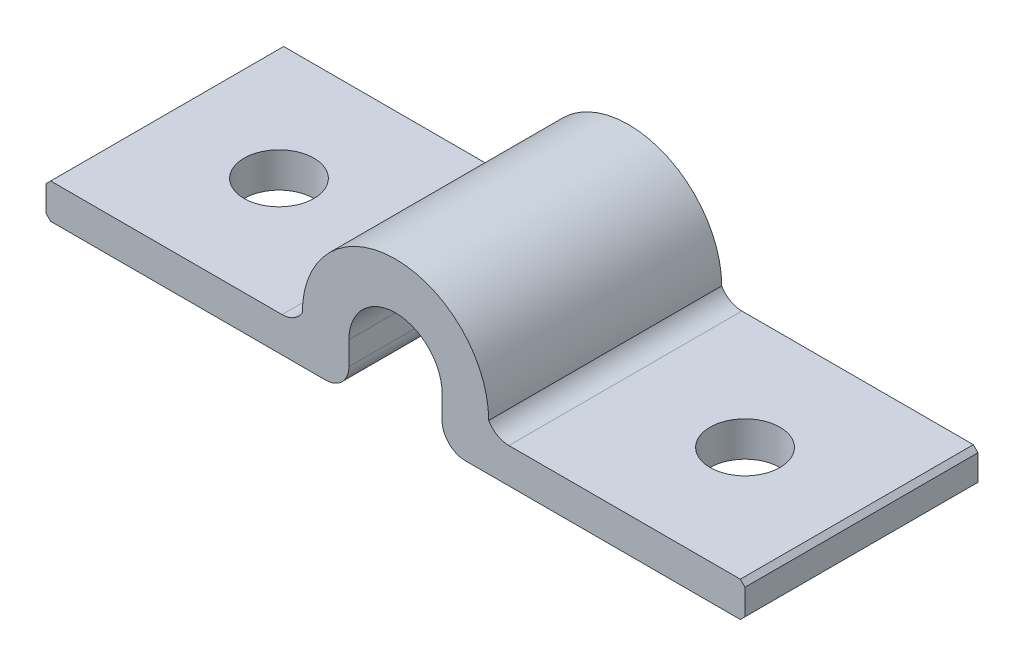
ISO-10303-21;
HEADER;
FILE_DESCRIPTION(('STEP AP214'),'2;1');
FILE_NAME('part.step','',(''),(''),'','','');
FILE_SCHEMA(('AUTOMOTIVE_DESIGN { 1 0 10303 214 1 1 1 1 }'));
ENDSEC;
DATA;
#1=APPLICATION_CONTEXT('core data for automotive mechanical design processes');
#2=APPLICATION_PROTOCOL_DEFINITION('international standard','automotive_design',2000,#1);
#3=PRODUCT_CONTEXT('',#1,'mechanical');
#4=PRODUCT('Part','Part','',(#3));
#5=PRODUCT_RELATED_PRODUCT_CATEGORY('part','',(#4));
#6=PRODUCT_DEFINITION_FORMATION('','',#4);
#7=PRODUCT_DEFINITION_CONTEXT('part definition',#1,'design');
#8=PRODUCT_DEFINITION('design','',#6,#7);
#9=PRODUCT_DEFINITION_SHAPE('','',#8);
#10=(LENGTH_UNIT() NAMED_UNIT(*) SI_UNIT(.MILLI.,.METRE.));
#11=(NAMED_UNIT(*) PLANE_ANGLE_UNIT() SI_UNIT($,.RADIAN.));
#12=(NAMED_UNIT(*) SI_UNIT($,.STERADIAN.) SOLID_ANGLE_UNIT());
#13=UNCERTAINTY_MEASURE_WITH_UNIT(LENGTH_MEASURE(1.E-05),#10,'distance_accuracy_value','');
#14=(GEOMETRIC_REPRESENTATION_CONTEXT(3) GLOBAL_UNCERTAINTY_ASSIGNED_CONTEXT((#13)) GLOBAL_UNIT_ASSIGNED_CONTEXT((#10,
#11,#12)) REPRESENTATION_CONTEXT('',''));
#15=CARTESIAN_POINT('',(0.,0.,0.));
#16=DIRECTION('',(0.,0.,1.));
#17=DIRECTION('',(1.,0.,0.));
#18=AXIS2_PLACEMENT_3D('',#15,#16,#17);
#19=CARTESIAN_POINT('',(-4.86602540378444,0.499999999999999,10.));
#20=DIRECTION('',(0.,0.,-1.));
#21=DIRECTION('',(-1.,0.,0.));
#22=AXIS2_PLACEMENT_3D('',#19,#20,#21);
#23=CYLINDRICAL_SURFACE('',#22,1.);
#24=CARTESIAN_POINT('',(-4.86602540378444,0.499999999999999,0.));
#25=DIRECTION('',(0.,0.,-1.));
#26=DIRECTION('',(1.,0.,0.));
#27=AXIS2_PLACEMENT_3D('',#24,#25,#26);
#28=CIRCLE('',#27,1.);
#29=CARTESIAN_POINT('',(-4.,0.,0.));
#30=VERTEX_POINT('',#29);
#31=CARTESIAN_POINT('',(-4.86602540378444,-0.500000000000001,0.));
#32=VERTEX_POINT('',#31);
#33=EDGE_CURVE('E158',#30,#32,#28,.T.);
#34=ORIENTED_EDGE('',*,*,#33,.T.);
#35=DIRECTION('',(0.,0.,-1.));
#36=VECTOR('',#35,1.);
#37=CARTESIAN_POINT('',(-4.86602540378444,-0.500000000000001,10.));
#38=LINE('',#37,#36);
#39=CARTESIAN_POINT('',(-4.86602540378444,-0.500000000000001,10.));
#40=VERTEX_POINT('',#39);
#41=EDGE_CURVE('E11',#40,#32,#38,.T.);
#42=ORIENTED_EDGE('',*,*,#41,.F.);
#43=CARTESIAN_POINT('',(-4.86602540378444,0.499999999999999,10.));
#44=DIRECTION('',(0.,0.,-1.));
#45=DIRECTION('',(1.,0.,0.));
#46=AXIS2_PLACEMENT_3D('',#43,#44,#45);
#47=CIRCLE('',#46,1.);
#48=CARTESIAN_POINT('',(-4.,0.,10.));
#49=VERTEX_POINT('',#48);
#50=EDGE_CURVE('E187',#49,#40,#47,.T.);
#51=ORIENTED_EDGE('',*,*,#50,.F.);
#52=DIRECTION('',(0.,0.,-1.));
#53=VECTOR('',#52,1.);
#54=CARTESIAN_POINT('',(-4.,0.,10.));
#55=LINE('',#54,#53);
#56=EDGE_CURVE('E157',#49,#30,#55,.T.);
#57=ORIENTED_EDGE('',*,*,#56,.T.);
#58=EDGE_LOOP('',(#34,#42,#51,#57));
#59=FACE_BOUND('',#58,.T.);
#60=ADVANCED_FACE('F39',(#59),#23,.F.);
#61=CARTESIAN_POINT('',(-4.86602540378444,-0.500000000000001,10.));
#62=DIRECTION('',(0.,-1.,0.));
#63=DIRECTION('',(1.,0.,0.));
#64=AXIS2_PLACEMENT_3D('',#61,#62,#63);
#65=PLANE('',#64);
#66=CARTESIAN_POINT('',(-10.,-0.500000000000001,5.));
#67=DIRECTION('',(0.,1.,0.));
#68=DIRECTION('',(-1.,0.,0.));
#69=AXIS2_PLACEMENT_3D('',#66,#67,#68);
#70=CIRCLE('',#69,1.5);
#71=CARTESIAN_POINT('',(-11.5,-0.500000000000001,5.));
#72=VERTEX_POINT('',#71);
#73=EDGE_CURVE('E242',#72,#72,#70,.T.);
#74=ORIENTED_EDGE('',*,*,#73,.F.);
#75=EDGE_LOOP('',(#74));
#76=FACE_BOUND('',#75,.T.);
#77=DIRECTION('',(-1.,0.,0.));
#78=VECTOR('',#77,1.);
#79=CARTESIAN_POINT('',(-4.86602540378444,-0.500000000000001,0.));
#80=LINE('',#79,#78);
#81=CARTESIAN_POINT('',(-14.8,-0.500000000000002,0.));
#82=VERTEX_POINT('',#81);
#83=EDGE_CURVE('E162',#32,#82,#80,.T.);
#84=ORIENTED_EDGE('',*,*,#83,.T.);
#85=DIRECTION('',(0.,0.,-1.));
#86=VECTOR('',#85,1.);
#87=CARTESIAN_POINT('',(-14.8,-0.500000000000002,10.));
#88=LINE('',#87,#86);
#89=CARTESIAN_POINT('',(-14.8,-0.500000000000002,10.));
#90=VERTEX_POINT('',#89);
#91=EDGE_CURVE('E49',#90,#82,#88,.T.);
#92=ORIENTED_EDGE('',*,*,#91,.F.);
#93=DIRECTION('',(-1.,0.,0.));
#94=VECTOR('',#93,1.);
#95=CARTESIAN_POINT('',(-4.86602540378444,-0.500000000000001,10.));
#96=LINE('',#95,#94);
#97=EDGE_CURVE('E106',#40,#90,#96,.T.);
#98=ORIENTED_EDGE('',*,*,#97,.F.);
#99=ORIENTED_EDGE('',*,*,#41,.T.);
#100=EDGE_LOOP('',(#84,#92,#98,#99));
#101=FACE_BOUND('',#100,.T.);
#102=ADVANCED_FACE('F368',(#76,#101),#65,.F.);
#103=CARTESIAN_POINT('',(-14.8,-0.500000000000002,10.));
#104=DIRECTION('',(0.707106781186547,-0.707106781186548,0.));
#105=DIRECTION('',(0.707106781186548,0.707106781186547,0.));
#106=AXIS2_PLACEMENT_3D('',#103,#104,#105);
#107=PLANE('',#106);
#108=DIRECTION('',(-0.707106781186548,-0.707106781186547,0.));
#109=VECTOR('',#108,1.);
#110=CARTESIAN_POINT('',(-14.8,-0.500000000000002,0.));
#111=LINE('',#110,#109);
#112=CARTESIAN_POINT('',(-15.,-0.700000000000002,0.));
#113=VERTEX_POINT('',#112);
#114=EDGE_CURVE('E165',#82,#113,#111,.T.);
#115=ORIENTED_EDGE('',*,*,#114,.T.);
#116=DIRECTION('',(0.,0.,-1.));
#117=VECTOR('',#116,1.);
#118=CARTESIAN_POINT('',(-15.,-0.700000000000002,10.));
#119=LINE('',#118,#117);
#120=CARTESIAN_POINT('',(-15.,-0.700000000000002,10.));
#121=VERTEX_POINT('',#120);
#122=EDGE_CURVE('E202',#121,#113,#119,.T.);
#123=ORIENTED_EDGE('',*,*,#122,.F.);
#124=DIRECTION('',(-0.707106781186548,-0.707106781186547,0.));
#125=VECTOR('',#124,1.);
#126=CARTESIAN_POINT('',(-14.8,-0.500000000000002,10.));
#127=LINE('',#126,#125);
#128=EDGE_CURVE('E213',#90,#121,#127,.T.);
#129=ORIENTED_EDGE('',*,*,#128,.F.);
#130=ORIENTED_EDGE('',*,*,#91,.T.);
#131=EDGE_LOOP('',(#115,#123,#129,#130));
#132=FACE_BOUND('',#131,.T.);
#133=ADVANCED_FACE('F211',(#132),#107,.F.);
#134=CARTESIAN_POINT('',(-15.,-0.700000000000002,10.));
#135=DIRECTION('',(1.,0.,0.));
#136=DIRECTION('',(0.,0.,-1.));
#137=AXIS2_PLACEMENT_3D('',#134,#135,#136);
#138=PLANE('',#137);
#139=DIRECTION('',(0.,-1.,0.));
#140=VECTOR('',#139,1.);
#141=CARTESIAN_POINT('',(-15.,-0.700000000000002,0.));
#142=LINE('',#141,#140);
#143=CARTESIAN_POINT('',(-15.,-1.8,0.));
#144=VERTEX_POINT('',#143);
#145=EDGE_CURVE('E168',#113,#144,#142,.T.);
#146=ORIENTED_EDGE('',*,*,#145,.T.);
#147=DIRECTION('',(0.,0.,-1.));
#148=VECTOR('',#147,1.);
#149=CARTESIAN_POINT('',(-15.,-1.8,10.));
#150=LINE('',#149,#148);
#151=CARTESIAN_POINT('',(-15.,-1.8,10.));
#152=VERTEX_POINT('',#151);
#153=EDGE_CURVE('E198',#152,#144,#150,.T.);
#154=ORIENTED_EDGE('',*,*,#153,.F.);
#155=DIRECTION('',(0.,-1.,0.));
#156=VECTOR('',#155,1.);
#157=CARTESIAN_POINT('',(-15.,-0.700000000000002,10.));
#158=LINE('',#157,#156);
#159=EDGE_CURVE('E230',#121,#152,#158,.T.);
#160=ORIENTED_EDGE('',*,*,#159,.F.);
#161=ORIENTED_EDGE('',*,*,#122,.T.);
#162=EDGE_LOOP('',(#146,#154,#160,#161));
#163=FACE_BOUND('',#162,.T.);
#164=ADVANCED_FACE('F222',(#163),#138,.F.);
#165=CARTESIAN_POINT('',(-14.8,-2.,10.));
#166=DIRECTION('',(0.707106781186547,0.707106781186548,0.));
#167=DIRECTION('',(-0.707106781186548,0.707106781186547,0.));
#168=AXIS2_PLACEMENT_3D('',#165,#166,#167);
#169=PLANE('',#168);
#170=DIRECTION('',(0.707106781186548,-0.707106781186547,0.));
#171=VECTOR('',#170,1.);
#172=CARTESIAN_POINT('',(-14.8,-2.,0.));
#173=LINE('',#172,#171);
#174=CARTESIAN_POINT('',(-14.8,-2.,0.));
#175=VERTEX_POINT('',#174);
#176=EDGE_CURVE('E171',#144,#175,#173,.T.);
#177=ORIENTED_EDGE('',*,*,#176,.T.);
#178=DIRECTION('',(0.,0.,-1.));
#179=VECTOR('',#178,1.);
#180=CARTESIAN_POINT('',(-14.8,-2.,10.));
#181=LINE('',#180,#179);
#182=CARTESIAN_POINT('',(-14.8,-2.,10.));
#183=VERTEX_POINT('',#182);
#184=EDGE_CURVE('E194',#183,#175,#181,.T.);
#185=ORIENTED_EDGE('',*,*,#184,.F.);
#186=DIRECTION('',(0.707106781186548,-0.707106781186547,0.));
#187=VECTOR('',#186,1.);
#188=CARTESIAN_POINT('',(-14.8,-2.,10.));
#189=LINE('',#188,#187);
#190=EDGE_CURVE('E228',#152,#183,#189,.T.);
#191=ORIENTED_EDGE('',*,*,#190,.F.);
#192=ORIENTED_EDGE('',*,*,#153,.T.);
#193=EDGE_LOOP('',(#177,#185,#191,#192));
#194=FACE_BOUND('',#193,.T.);
#195=ADVANCED_FACE('F226',(#194),#169,.F.);
#196=CARTESIAN_POINT('',(-3.,-2.,10.));
#197=DIRECTION('',(0.,1.,0.));
#198=DIRECTION('',(-1.,0.,0.));
#199=AXIS2_PLACEMENT_3D('',#196,#197,#198);
#200=PLANE('',#199);
#201=CARTESIAN_POINT('',(-10.,-2.,5.));
#202=DIRECTION('',(0.,1.,0.));
#203=DIRECTION('',(-1.,0.,0.));
#204=AXIS2_PLACEMENT_3D('',#201,#202,#203);
#205=CIRCLE('',#204,1.5);
#206=CARTESIAN_POINT('',(-11.5,-2.,5.));
#207=VERTEX_POINT('',#206);
#208=EDGE_CURVE('E42',#207,#207,#205,.T.);
#209=ORIENTED_EDGE('',*,*,#208,.T.);
#210=EDGE_LOOP('',(#209));
#211=FACE_BOUND('',#210,.T.);
#212=DIRECTION('',(1.,0.,0.));
#213=VECTOR('',#212,1.);
#214=CARTESIAN_POINT('',(-3.,-2.,0.));
#215=LINE('',#214,#213);
#216=CARTESIAN_POINT('',(-3.,-2.,0.));
#217=VERTEX_POINT('',#216);
#218=EDGE_CURVE('E174',#175,#217,#215,.T.);
#219=ORIENTED_EDGE('',*,*,#218,.T.);
#220=DIRECTION('',(0.,0.,-1.));
#221=VECTOR('',#220,1.);
#222=CARTESIAN_POINT('',(-3.,-2.,10.));
#223=LINE('',#222,#221);
#224=CARTESIAN_POINT('',(-3.,-2.,10.));
#225=VERTEX_POINT('',#224);
#226=EDGE_CURVE('E143',#225,#217,#223,.T.);
#227=ORIENTED_EDGE('',*,*,#226,.F.);
#228=DIRECTION('',(1.,0.,0.));
#229=VECTOR('',#228,1.);
#230=CARTESIAN_POINT('',(-3.,-2.,10.));
#231=LINE('',#230,#229);
#232=EDGE_CURVE('E132',#183,#225,#231,.T.);
#233=ORIENTED_EDGE('',*,*,#232,.F.);
#234=ORIENTED_EDGE('',*,*,#184,.T.);
#235=EDGE_LOOP('',(#219,#227,#233,#234));
#236=FACE_BOUND('',#235,.T.);
#237=ADVANCED_FACE('F450',(#211,#236),#200,.F.);
#238=CARTESIAN_POINT('',(-3.,-1.,10.));
#239=DIRECTION('',(0.,0.,-1.));
#240=DIRECTION('',(-1.,0.,0.));
#241=AXIS2_PLACEMENT_3D('',#238,#239,#240);
#242=CYLINDRICAL_SURFACE('',#241,1.);
#243=CARTESIAN_POINT('',(-3.,-1.,0.));
#244=DIRECTION('',(0.,0.,1.));
#245=DIRECTION('',(-1.,0.,0.));
#246=AXIS2_PLACEMENT_3D('',#243,#244,#245);
#247=CIRCLE('',#246,1.);
#248=CARTESIAN_POINT('',(-2.,-1.,0.));
#249=VERTEX_POINT('',#248);
#250=EDGE_CURVE('E141',#217,#249,#247,.T.);
#251=ORIENTED_EDGE('',*,*,#250,.T.);
#252=DIRECTION('',(0.,0.,-1.));
#253=VECTOR('',#252,1.);
#254=CARTESIAN_POINT('',(-2.,-1.,10.));
#255=LINE('',#254,#253);
#256=CARTESIAN_POINT('',(-2.,-1.,10.));
#257=VERTEX_POINT('',#256);
#258=EDGE_CURVE('E138',#257,#249,#255,.T.);
#259=ORIENTED_EDGE('',*,*,#258,.F.);
#260=CARTESIAN_POINT('',(-3.,-1.,10.));
#261=DIRECTION('',(0.,0.,1.));
#262=DIRECTION('',(-1.,0.,0.));
#263=AXIS2_PLACEMENT_3D('',#260,#261,#262);
#264=CIRCLE('',#263,1.);
#265=EDGE_CURVE('E125',#225,#257,#264,.T.);
#266=ORIENTED_EDGE('',*,*,#265,.F.);
#267=ORIENTED_EDGE('',*,*,#226,.T.);
#268=EDGE_LOOP('',(#251,#259,#266,#267));
#269=FACE_BOUND('',#268,.T.);
#270=ADVANCED_FACE('F139',(#269),#242,.T.);
#271=CARTESIAN_POINT('',(-2.,0.,10.));
#272=DIRECTION('',(-1.,0.,0.));
#273=DIRECTION('',(0.,-1.,0.));
#274=AXIS2_PLACEMENT_3D('',#271,#272,#273);
#275=PLANE('',#274);
#276=DIRECTION('',(0.,1.,0.));
#277=VECTOR('',#276,1.);
#278=CARTESIAN_POINT('',(-2.,0.,0.));
#279=LINE('',#278,#277);
#280=CARTESIAN_POINT('',(-2.,0.,0.));
#281=VERTEX_POINT('',#280);
#282=EDGE_CURVE('E91',#249,#281,#279,.T.);
#283=ORIENTED_EDGE('',*,*,#282,.T.);
#284=DIRECTION('',(0.,0.,-1.));
#285=VECTOR('',#284,1.);
#286=CARTESIAN_POINT('',(-2.,0.,10.));
#287=LINE('',#286,#285);
#288=CARTESIAN_POINT('',(-2.,0.,10.));
#289=VERTEX_POINT('',#288);
#290=EDGE_CURVE('E144',#289,#281,#287,.T.);
#291=ORIENTED_EDGE('',*,*,#290,.F.);
#292=DIRECTION('',(0.,1.,0.));
#293=VECTOR('',#292,1.);
#294=CARTESIAN_POINT('',(-2.,0.,10.));
#295=LINE('',#294,#293);
#296=EDGE_CURVE('E130',#257,#289,#295,.T.);
#297=ORIENTED_EDGE('',*,*,#296,.F.);
#298=ORIENTED_EDGE('',*,*,#258,.T.);
#299=EDGE_LOOP('',(#283,#291,#297,#298));
#300=FACE_BOUND('',#299,.T.);
#301=ADVANCED_FACE('F146',(#300),#275,.F.);
#302=CARTESIAN_POINT('',(0.,0.,10.));
#303=DIRECTION('',(0.,0.,-1.));
#304=DIRECTION('',(-1.,0.,0.));
#305=AXIS2_PLACEMENT_3D('',#302,#303,#304);
#306=CYLINDRICAL_SURFACE('',#305,2.);
#307=CARTESIAN_POINT('',(0.,0.,0.));
#308=DIRECTION('',(0.,0.,-1.));
#309=DIRECTION('',(1.,0.,0.));
#310=AXIS2_PLACEMENT_3D('',#307,#308,#309);
#311=CIRCLE('',#310,2.);
#312=CARTESIAN_POINT('',(2.,0.,0.));
#313=VERTEX_POINT('',#312);
#314=EDGE_CURVE('E181',#281,#313,#311,.T.);
#315=ORIENTED_EDGE('',*,*,#314,.T.);
#316=DIRECTION('',(0.,0.,-1.));
#317=VECTOR('',#316,1.);
#318=CARTESIAN_POINT('',(2.,0.,10.));
#319=LINE('',#318,#317);
#320=CARTESIAN_POINT('',(2.,0.,10.));
#321=VERTEX_POINT('',#320);
#322=EDGE_CURVE('E249',#321,#313,#319,.T.);
#323=ORIENTED_EDGE('',*,*,#322,.F.);
#324=CARTESIAN_POINT('',(0.,0.,10.));
#325=DIRECTION('',(0.,0.,-1.));
#326=DIRECTION('',(1.,0.,0.));
#327=AXIS2_PLACEMENT_3D('',#324,#325,#326);
#328=CIRCLE('',#327,2.);
#329=EDGE_CURVE('E149',#289,#321,#328,.T.);
#330=ORIENTED_EDGE('',*,*,#329,.F.);
#331=ORIENTED_EDGE('',*,*,#290,.T.);
#332=EDGE_LOOP('',(#315,#323,#330,#331));
#333=FACE_BOUND('',#332,.T.);
#334=ADVANCED_FACE('F442',(#333),#306,.F.);
#335=CARTESIAN_POINT('',(0.,0.,10.));
#336=DIRECTION('',(0.,0.,-1.));
#337=DIRECTION('',(-1.,0.,0.));
#338=AXIS2_PLACEMENT_3D('',#335,#336,#337);
#339=CYLINDRICAL_SURFACE('',#338,4.);
#340=CARTESIAN_POINT('',(0.,0.,0.));
#341=DIRECTION('',(0.,0.,1.));
#342=DIRECTION('',(1.,0.,0.));
#343=AXIS2_PLACEMENT_3D('',#340,#341,#342);
#344=CIRCLE('',#343,4.);
#345=CARTESIAN_POINT('',(4.,0.,0.));
#346=VERTEX_POINT('',#345);
#347=EDGE_CURVE('E98',#346,#30,#344,.T.);
#348=ORIENTED_EDGE('',*,*,#347,.T.);
#349=ORIENTED_EDGE('',*,*,#56,.F.);
#350=CARTESIAN_POINT('',(0.,0.,10.));
#351=DIRECTION('',(0.,0.,1.));
#352=DIRECTION('',(1.,0.,0.));
#353=AXIS2_PLACEMENT_3D('',#350,#351,#352);
#354=CIRCLE('',#353,4.);
#355=CARTESIAN_POINT('',(4.,0.,10.));
#356=VERTEX_POINT('',#355);
#357=EDGE_CURVE('E57',#356,#49,#354,.T.);
#358=ORIENTED_EDGE('',*,*,#357,.F.);
#359=DIRECTION('',(0.,0.,-1.));
#360=VECTOR('',#359,1.);
#361=CARTESIAN_POINT('',(4.,0.,10.));
#362=LINE('',#361,#360);
#363=EDGE_CURVE('E246',#356,#346,#362,.T.);
#364=ORIENTED_EDGE('',*,*,#363,.T.);
#365=EDGE_LOOP('',(#348,#349,#358,#364));
#366=FACE_BOUND('',#365,.T.);
#367=ADVANCED_FACE('F382',(#366),#339,.T.);
#368=CARTESIAN_POINT('',(-4.86602540378444,0.499999999999999,10.));
#369=DIRECTION('',(0.,0.,1.));
#370=DIRECTION('',(1.,0.,0.));
#371=AXIS2_PLACEMENT_3D('',#368,#369,#370);
#372=PLANE('',#371);
#373=ORIENTED_EDGE('',*,*,#50,.T.);
#374=ORIENTED_EDGE('',*,*,#97,.T.);
#375=ORIENTED_EDGE('',*,*,#128,.T.);
#376=ORIENTED_EDGE('',*,*,#159,.T.);
#377=ORIENTED_EDGE('',*,*,#190,.T.);
#378=ORIENTED_EDGE('',*,*,#232,.T.);
#379=ORIENTED_EDGE('',*,*,#265,.T.);
#380=ORIENTED_EDGE('',*,*,#296,.T.);
#381=ORIENTED_EDGE('',*,*,#329,.T.);
#382=DIRECTION('',(0.,1.,0.));
#383=VECTOR('',#382,1.);
#384=CARTESIAN_POINT('',(2.,0.,10.));
#385=LINE('',#384,#383);
#386=CARTESIAN_POINT('',(2.,-1.,10.));
#387=VERTEX_POINT('',#386);
#388=EDGE_CURVE('E339',#387,#321,#385,.T.);
#389=ORIENTED_EDGE('',*,*,#388,.F.);
#390=CARTESIAN_POINT('',(3.,-1.,10.));
#391=DIRECTION('',(0.,0.,-1.));
#392=DIRECTION('',(1.,0.,0.));
#393=AXIS2_PLACEMENT_3D('',#390,#391,#392);
#394=CIRCLE('',#393,1.);
#395=CARTESIAN_POINT('',(3.,-2.,10.));
#396=VERTEX_POINT('',#395);
#397=EDGE_CURVE('E335',#396,#387,#394,.T.);
#398=ORIENTED_EDGE('',*,*,#397,.F.);
#399=DIRECTION('',(-1.,0.,0.));
#400=VECTOR('',#399,1.);
#401=CARTESIAN_POINT('',(3.,-2.,10.));
#402=LINE('',#401,#400);
#403=CARTESIAN_POINT('',(14.8,-2.,10.));
#404=VERTEX_POINT('',#403);
#405=EDGE_CURVE('E331',#404,#396,#402,.T.);
#406=ORIENTED_EDGE('',*,*,#405,.F.);
#407=DIRECTION('',(-0.707106781186548,-0.707106781186547,0.));
#408=VECTOR('',#407,1.);
#409=CARTESIAN_POINT('',(14.8,-2.,10.));
#410=LINE('',#409,#408);
#411=CARTESIAN_POINT('',(15.,-1.8,10.));
#412=VERTEX_POINT('',#411);
#413=EDGE_CURVE('E327',#412,#404,#410,.T.);
#414=ORIENTED_EDGE('',*,*,#413,.F.);
#415=DIRECTION('',(0.,-1.,0.));
#416=VECTOR('',#415,1.);
#417=CARTESIAN_POINT('',(15.,-0.700000000000002,10.));
#418=LINE('',#417,#416);
#419=CARTESIAN_POINT('',(15.,-0.700000000000002,10.));
#420=VERTEX_POINT('',#419);
#421=EDGE_CURVE('E323',#420,#412,#418,.T.);
#422=ORIENTED_EDGE('',*,*,#421,.F.);
#423=DIRECTION('',(0.707106781186548,-0.707106781186547,0.));
#424=VECTOR('',#423,1.);
#425=CARTESIAN_POINT('',(14.8,-0.500000000000002,10.));
#426=LINE('',#425,#424);
#427=CARTESIAN_POINT('',(14.8,-0.500000000000002,10.));
#428=VERTEX_POINT('',#427);
#429=EDGE_CURVE('E319',#428,#420,#426,.T.);
#430=ORIENTED_EDGE('',*,*,#429,.F.);
#431=DIRECTION('',(1.,0.,0.));
#432=VECTOR('',#431,1.);
#433=CARTESIAN_POINT('',(4.86602540378444,-0.500000000000001,10.));
#434=LINE('',#433,#432);
#435=CARTESIAN_POINT('',(4.86602540378444,-0.500000000000001,10.));
#436=VERTEX_POINT('',#435);
#437=EDGE_CURVE('E281',#436,#428,#434,.T.);
#438=ORIENTED_EDGE('',*,*,#437,.F.);
#439=CARTESIAN_POINT('',(4.86602540378444,0.499999999999999,10.));
#440=DIRECTION('',(0.,0.,1.));
#441=DIRECTION('',(-1.,0.,0.));
#442=AXIS2_PLACEMENT_3D('',#439,#440,#441);
#443=CIRCLE('',#442,1.);
#444=EDGE_CURVE('E286',#356,#436,#443,.T.);
#445=ORIENTED_EDGE('',*,*,#444,.F.);
#446=ORIENTED_EDGE('',*,*,#357,.T.);
#447=EDGE_LOOP('',(#373,#374,#375,#376,#377,#378,#379,#380,#381,#389,#398,#406,#414,#422,#430,
#438,#445,#446));
#448=FACE_BOUND('',#447,.T.);
#449=ADVANCED_FACE('F127',(#448),#372,.T.);
#450=CARTESIAN_POINT('',(-4.86602540378444,0.499999999999999,0.));
#451=DIRECTION('',(0.,0.,1.));
#452=DIRECTION('',(1.,0.,0.));
#453=AXIS2_PLACEMENT_3D('',#450,#451,#452);
#454=PLANE('',#453);
#455=ORIENTED_EDGE('',*,*,#33,.F.);
#456=ORIENTED_EDGE('',*,*,#347,.F.);
#457=CARTESIAN_POINT('',(4.86602540378444,0.499999999999999,0.));
#458=DIRECTION('',(0.,0.,1.));
#459=DIRECTION('',(-1.,0.,0.));
#460=AXIS2_PLACEMENT_3D('',#457,#458,#459);
#461=CIRCLE('',#460,1.);
#462=CARTESIAN_POINT('',(4.86602540378444,-0.500000000000001,0.));
#463=VERTEX_POINT('',#462);
#464=EDGE_CURVE('E311',#346,#463,#461,.T.);
#465=ORIENTED_EDGE('',*,*,#464,.T.);
#466=DIRECTION('',(1.,0.,0.));
#467=VECTOR('',#466,1.);
#468=CARTESIAN_POINT('',(4.86602540378444,-0.500000000000001,0.));
#469=LINE('',#468,#467);
#470=CARTESIAN_POINT('',(14.8,-0.500000000000002,0.));
#471=VERTEX_POINT('',#470);
#472=EDGE_CURVE('E282',#463,#471,#469,.T.);
#473=ORIENTED_EDGE('',*,*,#472,.T.);
#474=DIRECTION('',(0.707106781186548,-0.707106781186547,0.));
#475=VECTOR('',#474,1.);
#476=CARTESIAN_POINT('',(14.8,-0.500000000000002,0.));
#477=LINE('',#476,#475);
#478=CARTESIAN_POINT('',(15.,-0.700000000000002,0.));
#479=VERTEX_POINT('',#478);
#480=EDGE_CURVE('E287',#471,#479,#477,.T.);
#481=ORIENTED_EDGE('',*,*,#480,.T.);
#482=DIRECTION('',(0.,-1.,0.));
#483=VECTOR('',#482,1.);
#484=CARTESIAN_POINT('',(15.,-0.700000000000002,0.));
#485=LINE('',#484,#483);
#486=CARTESIAN_POINT('',(15.,-1.8,0.));
#487=VERTEX_POINT('',#486);
#488=EDGE_CURVE('E291',#479,#487,#485,.T.);
#489=ORIENTED_EDGE('',*,*,#488,.T.);
#490=DIRECTION('',(-0.707106781186548,-0.707106781186547,0.));
#491=VECTOR('',#490,1.);
#492=CARTESIAN_POINT('',(14.8,-2.,0.));
#493=LINE('',#492,#491);
#494=CARTESIAN_POINT('',(14.8,-2.,0.));
#495=VERTEX_POINT('',#494);
#496=EDGE_CURVE('E295',#487,#495,#493,.T.);
#497=ORIENTED_EDGE('',*,*,#496,.T.);
#498=DIRECTION('',(-1.,0.,0.));
#499=VECTOR('',#498,1.);
#500=CARTESIAN_POINT('',(3.,-2.,0.));
#501=LINE('',#500,#499);
#502=CARTESIAN_POINT('',(3.,-2.,0.));
#503=VERTEX_POINT('',#502);
#504=EDGE_CURVE('E299',#495,#503,#501,.T.);
#505=ORIENTED_EDGE('',*,*,#504,.T.);
#506=CARTESIAN_POINT('',(3.,-1.,0.));
#507=DIRECTION('',(0.,0.,-1.));
#508=DIRECTION('',(1.,0.,0.));
#509=AXIS2_PLACEMENT_3D('',#506,#507,#508);
#510=CIRCLE('',#509,1.);
#511=CARTESIAN_POINT('',(2.,-1.,0.));
#512=VERTEX_POINT('',#511);
#513=EDGE_CURVE('E303',#503,#512,#510,.T.);
#514=ORIENTED_EDGE('',*,*,#513,.T.);
#515=DIRECTION('',(0.,1.,0.));
#516=VECTOR('',#515,1.);
#517=CARTESIAN_POINT('',(2.,0.,0.));
#518=LINE('',#517,#516);
#519=EDGE_CURVE('E307',#512,#313,#518,.T.);
#520=ORIENTED_EDGE('',*,*,#519,.T.);
#521=ORIENTED_EDGE('',*,*,#314,.F.);
#522=ORIENTED_EDGE('',*,*,#282,.F.);
#523=ORIENTED_EDGE('',*,*,#250,.F.);
#524=ORIENTED_EDGE('',*,*,#218,.F.);
#525=ORIENTED_EDGE('',*,*,#176,.F.);
#526=ORIENTED_EDGE('',*,*,#145,.F.);
#527=ORIENTED_EDGE('',*,*,#114,.F.);
#528=ORIENTED_EDGE('',*,*,#83,.F.);
#529=EDGE_LOOP('',(#455,#456,#465,#473,#481,#489,#497,#505,#514,#520,#521,#522,#523,#524,#525,
#526,#527,#528));
#530=FACE_BOUND('',#529,.T.);
#531=ADVANCED_FACE('F217',(#530),#454,.F.);
#532=CARTESIAN_POINT('',(-9.99999999999999,-30.5,5.));
#533=DIRECTION('',(0.,1.,0.));
#534=DIRECTION('',(-1.,0.,0.));
#535=AXIS2_PLACEMENT_3D('',#532,#533,#534);
#536=CYLINDRICAL_SURFACE('',#535,1.5);
#537=ORIENTED_EDGE('',*,*,#73,.T.);
#538=EDGE_LOOP('',(#537));
#539=FACE_BOUND('',#538,.T.);
#540=ORIENTED_EDGE('',*,*,#208,.F.);
#541=EDGE_LOOP('',(#540));
#542=FACE_BOUND('',#541,.T.);
#543=ADVANCED_FACE('F507',(#539,#542),#536,.F.);
#544=CARTESIAN_POINT('',(4.86602540378444,0.499999999999999,10.));
#545=DIRECTION('',(0.,0.,-1.));
#546=DIRECTION('',(-1.,0.,0.));
#547=AXIS2_PLACEMENT_3D('',#544,#545,#546);
#548=CYLINDRICAL_SURFACE('',#547,1.);
#549=ORIENTED_EDGE('',*,*,#464,.F.);
#550=ORIENTED_EDGE('',*,*,#363,.F.);
#551=ORIENTED_EDGE('',*,*,#444,.T.);
#552=DIRECTION('',(0.,0.,-1.));
#553=VECTOR('',#552,1.);
#554=CARTESIAN_POINT('',(4.86602540378444,-0.500000000000001,10.));
#555=LINE('',#554,#553);
#556=EDGE_CURVE('E277',#436,#463,#555,.T.);
#557=ORIENTED_EDGE('',*,*,#556,.T.);
#558=EDGE_LOOP('',(#549,#550,#551,#557));
#559=FACE_BOUND('',#558,.T.);
#560=ADVANCED_FACE('F385',(#559),#548,.F.);
#561=CARTESIAN_POINT('',(2.,0.,10.));
#562=DIRECTION('',(-1.,0.,0.));
#563=DIRECTION('',(0.,-1.,0.));
#564=AXIS2_PLACEMENT_3D('',#561,#562,#563);
#565=PLANE('',#564);
#566=ORIENTED_EDGE('',*,*,#519,.F.);
#567=DIRECTION('',(0.,0.,-1.));
#568=VECTOR('',#567,1.);
#569=CARTESIAN_POINT('',(2.,-1.,10.));
#570=LINE('',#569,#568);
#571=EDGE_CURVE('E253',#387,#512,#570,.T.);
#572=ORIENTED_EDGE('',*,*,#571,.F.);
#573=ORIENTED_EDGE('',*,*,#388,.T.);
#574=ORIENTED_EDGE('',*,*,#322,.T.);
#575=EDGE_LOOP('',(#566,#572,#573,#574));
#576=FACE_BOUND('',#575,.T.);
#577=ADVANCED_FACE('F438',(#576),#565,.T.);
#578=CARTESIAN_POINT('',(3.,-1.,10.));
#579=DIRECTION('',(0.,0.,-1.));
#580=DIRECTION('',(-1.,0.,0.));
#581=AXIS2_PLACEMENT_3D('',#578,#579,#580);
#582=CYLINDRICAL_SURFACE('',#581,1.);
#583=ORIENTED_EDGE('',*,*,#513,.F.);
#584=DIRECTION('',(0.,0.,-1.));
#585=VECTOR('',#584,1.);
#586=CARTESIAN_POINT('',(3.,-2.,10.));
#587=LINE('',#586,#585);
#588=EDGE_CURVE('E257',#396,#503,#587,.T.);
#589=ORIENTED_EDGE('',*,*,#588,.F.);
#590=ORIENTED_EDGE('',*,*,#397,.T.);
#591=ORIENTED_EDGE('',*,*,#571,.T.);
#592=EDGE_LOOP('',(#583,#589,#590,#591));
#593=FACE_BOUND('',#592,.T.);
#594=ADVANCED_FACE('F431',(#593),#582,.T.);
#595=CARTESIAN_POINT('',(3.,-2.,10.));
#596=DIRECTION('',(0.,-1.,0.));
#597=DIRECTION('',(1.,0.,0.));
#598=AXIS2_PLACEMENT_3D('',#595,#596,#597);
#599=PLANE('',#598);
#600=CARTESIAN_POINT('',(10.,-2.,5.));
#601=DIRECTION('',(0.,-1.,0.));
#602=DIRECTION('',(1.,0.,0.));
#603=AXIS2_PLACEMENT_3D('',#600,#601,#602);
#604=CIRCLE('',#603,1.5);
#605=CARTESIAN_POINT('',(11.5,-2.,5.));
#606=VERTEX_POINT('',#605);
#607=EDGE_CURVE('E315',#606,#606,#604,.F.);
#608=ORIENTED_EDGE('',*,*,#607,.T.);
#609=EDGE_LOOP('',(#608));
#610=FACE_BOUND('',#609,.T.);
#611=ORIENTED_EDGE('',*,*,#504,.F.);
#612=DIRECTION('',(0.,0.,-1.));
#613=VECTOR('',#612,1.);
#614=CARTESIAN_POINT('',(14.8,-2.,10.));
#615=LINE('',#614,#613);
#616=EDGE_CURVE('E261',#404,#495,#615,.T.);
#617=ORIENTED_EDGE('',*,*,#616,.F.);
#618=ORIENTED_EDGE('',*,*,#405,.T.);
#619=ORIENTED_EDGE('',*,*,#588,.T.);
#620=EDGE_LOOP('',(#611,#617,#618,#619));
#621=FACE_BOUND('',#620,.T.);
#622=ADVANCED_FACE('F425',(#610,#621),#599,.T.);
#623=CARTESIAN_POINT('',(14.8,-2.,10.));
#624=DIRECTION('',(0.707106781186547,-0.707106781186548,0.));
#625=DIRECTION('',(0.707106781186548,0.707106781186547,0.));
#626=AXIS2_PLACEMENT_3D('',#623,#624,#625);
#627=PLANE('',#626);
#628=ORIENTED_EDGE('',*,*,#496,.F.);
#629=DIRECTION('',(0.,0.,-1.));
#630=VECTOR('',#629,1.);
#631=CARTESIAN_POINT('',(15.,-1.8,10.));
#632=LINE('',#631,#630);
#633=EDGE_CURVE('E265',#412,#487,#632,.T.);
#634=ORIENTED_EDGE('',*,*,#633,.F.);
#635=ORIENTED_EDGE('',*,*,#413,.T.);
#636=ORIENTED_EDGE('',*,*,#616,.T.);
#637=EDGE_LOOP('',(#628,#634,#635,#636));
#638=FACE_BOUND('',#637,.T.);
#639=ADVANCED_FACE('F419',(#638),#627,.T.);
#640=CARTESIAN_POINT('',(15.,-0.700000000000002,10.));
#641=DIRECTION('',(1.,0.,0.));
#642=DIRECTION('',(0.,0.,-1.));
#643=AXIS2_PLACEMENT_3D('',#640,#641,#642);
#644=PLANE('',#643);
#645=ORIENTED_EDGE('',*,*,#488,.F.);
#646=DIRECTION('',(0.,0.,-1.));
#647=VECTOR('',#646,1.);
#648=CARTESIAN_POINT('',(15.,-0.700000000000002,10.));
#649=LINE('',#648,#647);
#650=EDGE_CURVE('E269',#420,#479,#649,.T.);
#651=ORIENTED_EDGE('',*,*,#650,.F.);
#652=ORIENTED_EDGE('',*,*,#421,.T.);
#653=ORIENTED_EDGE('',*,*,#633,.T.);
#654=EDGE_LOOP('',(#645,#651,#652,#653));
#655=FACE_BOUND('',#654,.T.);
#656=ADVANCED_FACE('F413',(#655),#644,.T.);
#657=CARTESIAN_POINT('',(14.8,-0.500000000000002,10.));
#658=DIRECTION('',(0.707106781186547,0.707106781186548,0.));
#659=DIRECTION('',(-0.707106781186548,0.707106781186547,0.));
#660=AXIS2_PLACEMENT_3D('',#657,#658,#659);
#661=PLANE('',#660);
#662=ORIENTED_EDGE('',*,*,#480,.F.);
#663=DIRECTION('',(0.,0.,-1.));
#664=VECTOR('',#663,1.);
#665=CARTESIAN_POINT('',(14.8,-0.500000000000002,10.));
#666=LINE('',#665,#664);
#667=EDGE_CURVE('E273',#428,#471,#666,.T.);
#668=ORIENTED_EDGE('',*,*,#667,.F.);
#669=ORIENTED_EDGE('',*,*,#429,.T.);
#670=ORIENTED_EDGE('',*,*,#650,.T.);
#671=EDGE_LOOP('',(#662,#668,#669,#670));
#672=FACE_BOUND('',#671,.T.);
#673=ADVANCED_FACE('F364',(#672),#661,.T.);
#674=CARTESIAN_POINT('',(4.86602540378444,-0.500000000000001,10.));
#675=DIRECTION('',(0.,1.,0.));
#676=DIRECTION('',(-1.,0.,0.));
#677=AXIS2_PLACEMENT_3D('',#674,#675,#676);
#678=PLANE('',#677);
#679=CARTESIAN_POINT('',(10.,-0.500000000000001,5.));
#680=DIRECTION('',(0.,-1.,0.));
#681=DIRECTION('',(1.,0.,0.));
#682=AXIS2_PLACEMENT_3D('',#679,#680,#681);
#683=CIRCLE('',#682,1.5);
#684=CARTESIAN_POINT('',(11.5,-0.500000000000001,5.));
#685=VERTEX_POINT('',#684);
#686=EDGE_CURVE('E349',#685,#685,#683,.T.);
#687=ORIENTED_EDGE('',*,*,#686,.T.);
#688=EDGE_LOOP('',(#687));
#689=FACE_BOUND('',#688,.T.);
#690=ORIENTED_EDGE('',*,*,#472,.F.);
#691=ORIENTED_EDGE('',*,*,#556,.F.);
#692=ORIENTED_EDGE('',*,*,#437,.T.);
#693=ORIENTED_EDGE('',*,*,#667,.T.);
#694=EDGE_LOOP('',(#690,#691,#692,#693));
#695=FACE_BOUND('',#694,.T.);
#696=ADVANCED_FACE('F354',(#689,#695),#678,.T.);
#697=CARTESIAN_POINT('',(9.99999999999999,-30.5,5.));
#698=DIRECTION('',(0.,1.,0.));
#699=DIRECTION('',(-1.,0.,0.));
#700=AXIS2_PLACEMENT_3D('',#697,#698,#699);
#701=CYLINDRICAL_SURFACE('',#700,1.5);
#702=ORIENTED_EDGE('',*,*,#607,.F.);
#703=EDGE_LOOP('',(#702));
#704=FACE_BOUND('',#703,.T.);
#705=ORIENTED_EDGE('',*,*,#686,.F.);
#706=EDGE_LOOP('',(#705));
#707=FACE_BOUND('',#706,.T.);
#708=ADVANCED_FACE('F357',(#704,#707),#701,.F.);
#709=CLOSED_SHELL('',(#60,#102,#133,#164,#195,#237,#270,#301,#334,#367,#449,#531,#543,#560,#577,
#594,#622,#639,#656,#673,#696,#708));
#710=MANIFOLD_SOLID_BREP('B2',#709);
#711=ADVANCED_BREP_SHAPE_REPRESENTATION('',(#18,#710),#14);
#712=SHAPE_DEFINITION_REPRESENTATION(#9,#711);
ENDSEC;
END-ISO-10303-21;
